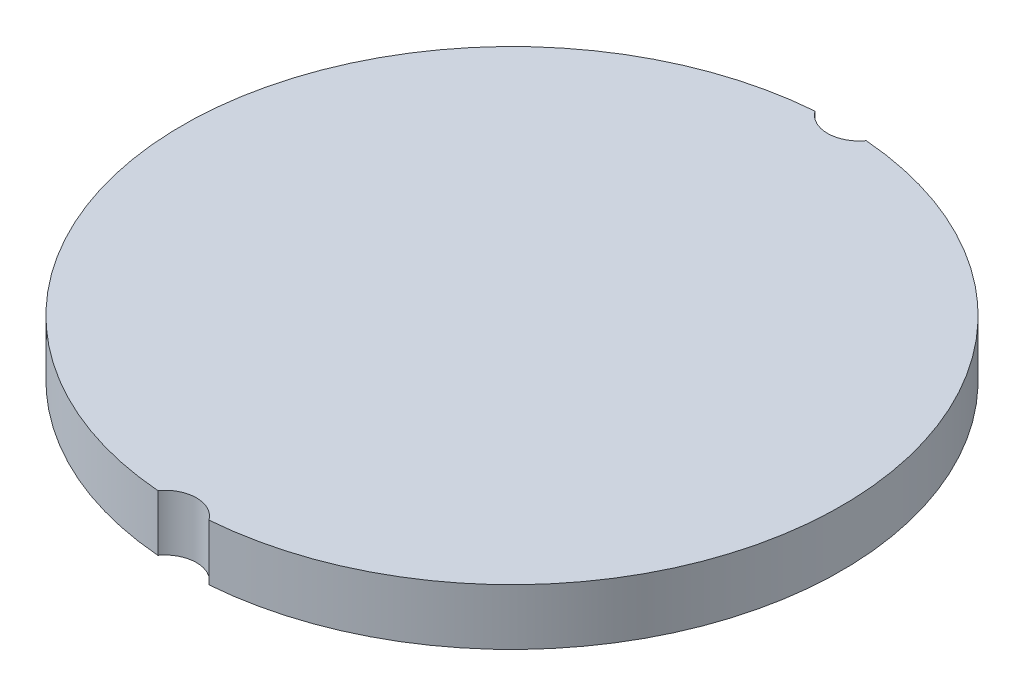
ISO-10303-21;
HEADER;
FILE_DESCRIPTION(('STEP AP214'),'2;1');
FILE_NAME('part.step','',(''),(''),'','','');
FILE_SCHEMA(('AUTOMOTIVE_DESIGN { 1 0 10303 214 1 1 1 1 }'));
ENDSEC;
DATA;
#1=APPLICATION_CONTEXT('core data for automotive mechanical design processes');
#2=APPLICATION_PROTOCOL_DEFINITION('international standard','automotive_design',2000,#1);
#3=PRODUCT_CONTEXT('',#1,'mechanical');
#4=PRODUCT('Part','Part','',(#3));
#5=PRODUCT_RELATED_PRODUCT_CATEGORY('part','',(#4));
#6=PRODUCT_DEFINITION_FORMATION('','',#4);
#7=PRODUCT_DEFINITION_CONTEXT('part definition',#1,'design');
#8=PRODUCT_DEFINITION('design','',#6,#7);
#9=PRODUCT_DEFINITION_SHAPE('','',#8);
#10=(LENGTH_UNIT() NAMED_UNIT(*) SI_UNIT(.MILLI.,.METRE.));
#11=(NAMED_UNIT(*) PLANE_ANGLE_UNIT() SI_UNIT($,.RADIAN.));
#12=(NAMED_UNIT(*) SI_UNIT($,.STERADIAN.) SOLID_ANGLE_UNIT());
#13=UNCERTAINTY_MEASURE_WITH_UNIT(LENGTH_MEASURE(1.E-05),#10,'distance_accuracy_value','');
#14=(GEOMETRIC_REPRESENTATION_CONTEXT(3) GLOBAL_UNCERTAINTY_ASSIGNED_CONTEXT((#13)) GLOBAL_UNIT_ASSIGNED_CONTEXT((#10,
#11,#12)) REPRESENTATION_CONTEXT('',''));
#15=CARTESIAN_POINT('',(0.,0.,0.));
#16=DIRECTION('',(0.,0.,1.));
#17=DIRECTION('',(1.,0.,0.));
#18=AXIS2_PLACEMENT_3D('',#15,#16,#17);
#19=CARTESIAN_POINT('',(7.15000000000003,20.5,20.8783901139862));
#20=DIRECTION('',(0.,-1.,0.));
#21=DIRECTION('',(0.,0.,-1.));
#22=AXIS2_PLACEMENT_3D('',#19,#20,#21);
#23=CYLINDRICAL_SURFACE('',#22,1.12839011398621);
#24=DIRECTION('',(0.,-1.,0.));
#25=VECTOR('',#24,1.);
#26=CARTESIAN_POINT('',(6.23756388030542,20.5,20.2145192102568));
#27=LINE('',#26,#25);
#28=CARTESIAN_POINT('',(6.23756388030542,20.5,20.2145192102568));
#29=VERTEX_POINT('',#28);
#30=CARTESIAN_POINT('',(6.23756388030542,18.5,20.2145192102568));
#31=VERTEX_POINT('',#30);
#32=EDGE_CURVE('E45',#29,#31,#27,.T.);
#33=ORIENTED_EDGE('',*,*,#32,.T.);
#34=CARTESIAN_POINT('',(7.15000000000003,18.5,20.8783901139862));
#35=DIRECTION('',(0.,1.,0.));
#36=DIRECTION('',(0.,0.,1.));
#37=AXIS2_PLACEMENT_3D('',#34,#35,#36);
#38=CIRCLE('',#37,1.12839011398621);
#39=CARTESIAN_POINT('',(8.06243611969464,18.5,20.2145192102568));
#40=VERTEX_POINT('',#39);
#41=EDGE_CURVE('E84',#40,#31,#38,.T.);
#42=ORIENTED_EDGE('',*,*,#41,.F.);
#43=DIRECTION('',(0.,-1.,0.));
#44=VECTOR('',#43,1.);
#45=CARTESIAN_POINT('',(8.06243611969464,20.5,20.2145192102568));
#46=LINE('',#45,#44);
#47=CARTESIAN_POINT('',(8.06243611969464,20.5,20.2145192102568));
#48=VERTEX_POINT('',#47);
#49=EDGE_CURVE('E11',#48,#40,#46,.T.);
#50=ORIENTED_EDGE('',*,*,#49,.F.);
#51=CARTESIAN_POINT('',(7.15000000000003,20.5,20.8783901139862));
#52=DIRECTION('',(0.,1.,0.));
#53=DIRECTION('',(0.,0.,1.));
#54=AXIS2_PLACEMENT_3D('',#51,#52,#53);
#55=CIRCLE('',#54,1.12839011398621);
#56=EDGE_CURVE('E86',#48,#29,#55,.T.);
#57=ORIENTED_EDGE('',*,*,#56,.T.);
#58=EDGE_LOOP('',(#33,#42,#50,#57));
#59=FACE_BOUND('',#58,.T.);
#60=ADVANCED_FACE('F42',(#59),#23,.F.);
#61=CARTESIAN_POINT('',(7.15000000000002,20.5,8.5));
#62=DIRECTION('',(0.,-1.,0.));
#63=DIRECTION('',(0.,0.,-1.));
#64=AXIS2_PLACEMENT_3D('',#61,#62,#63);
#65=CYLINDRICAL_SURFACE('',#64,11.75);
#66=ORIENTED_EDGE('',*,*,#49,.T.);
#67=CARTESIAN_POINT('',(7.15000000000002,18.5,8.5));
#68=DIRECTION('',(0.,1.,0.));
#69=DIRECTION('',(0.,0.,1.));
#70=AXIS2_PLACEMENT_3D('',#67,#68,#69);
#71=CIRCLE('',#70,11.75);
#72=CARTESIAN_POINT('',(8.06243611969464,18.5,-3.21451921025685));
#73=VERTEX_POINT('',#72);
#74=EDGE_CURVE('E98',#40,#73,#71,.T.);
#75=ORIENTED_EDGE('',*,*,#74,.T.);
#76=DIRECTION('',(0.,-1.,0.));
#77=VECTOR('',#76,1.);
#78=CARTESIAN_POINT('',(8.06243611969464,20.5,-3.21451921025685));
#79=LINE('',#78,#77);
#80=CARTESIAN_POINT('',(8.06243611969464,20.5,-3.21451921025685));
#81=VERTEX_POINT('',#80);
#82=EDGE_CURVE('E51',#81,#73,#79,.T.);
#83=ORIENTED_EDGE('',*,*,#82,.F.);
#84=CARTESIAN_POINT('',(7.15000000000002,20.5,8.5));
#85=DIRECTION('',(0.,1.,0.));
#86=DIRECTION('',(0.,0.,1.));
#87=AXIS2_PLACEMENT_3D('',#84,#85,#86);
#88=CIRCLE('',#87,11.75);
#89=EDGE_CURVE('E64',#48,#81,#88,.T.);
#90=ORIENTED_EDGE('',*,*,#89,.F.);
#91=EDGE_LOOP('',(#66,#75,#83,#90));
#92=FACE_BOUND('',#91,.T.);
#93=ADVANCED_FACE('F127',(#92),#65,.T.);
#94=CARTESIAN_POINT('',(7.15000000000003,20.5,-3.87839011398622));
#95=DIRECTION('',(0.,-1.,0.));
#96=DIRECTION('',(0.,0.,-1.));
#97=AXIS2_PLACEMENT_3D('',#94,#95,#96);
#98=CYLINDRICAL_SURFACE('',#97,1.12839011398621);
#99=ORIENTED_EDGE('',*,*,#82,.T.);
#100=CARTESIAN_POINT('',(7.15000000000003,18.5,-3.87839011398622));
#101=DIRECTION('',(0.,1.,0.));
#102=DIRECTION('',(0.,0.,1.));
#103=AXIS2_PLACEMENT_3D('',#100,#101,#102);
#104=CIRCLE('',#103,1.12839011398621);
#105=CARTESIAN_POINT('',(6.23756388030542,18.5,-3.21451921025685));
#106=VERTEX_POINT('',#105);
#107=EDGE_CURVE('E104',#106,#73,#104,.T.);
#108=ORIENTED_EDGE('',*,*,#107,.F.);
#109=DIRECTION('',(0.,-1.,0.));
#110=VECTOR('',#109,1.);
#111=CARTESIAN_POINT('',(6.23756388030542,20.5,-3.21451921025685));
#112=LINE('',#111,#110);
#113=CARTESIAN_POINT('',(6.23756388030542,20.5,-3.21451921025685));
#114=VERTEX_POINT('',#113);
#115=EDGE_CURVE('E91',#114,#106,#112,.T.);
#116=ORIENTED_EDGE('',*,*,#115,.F.);
#117=CARTESIAN_POINT('',(7.15000000000003,20.5,-3.87839011398622));
#118=DIRECTION('',(0.,1.,0.));
#119=DIRECTION('',(0.,0.,1.));
#120=AXIS2_PLACEMENT_3D('',#117,#118,#119);
#121=CIRCLE('',#120,1.12839011398621);
#122=EDGE_CURVE('E116',#114,#81,#121,.T.);
#123=ORIENTED_EDGE('',*,*,#122,.T.);
#124=EDGE_LOOP('',(#99,#108,#116,#123));
#125=FACE_BOUND('',#124,.T.);
#126=ADVANCED_FACE('F125',(#125),#98,.F.);
#127=CARTESIAN_POINT('',(7.15000000000002,20.5,8.5));
#128=DIRECTION('',(0.,-1.,0.));
#129=DIRECTION('',(0.,0.,-1.));
#130=AXIS2_PLACEMENT_3D('',#127,#128,#129);
#131=CYLINDRICAL_SURFACE('',#130,11.75);
#132=ORIENTED_EDGE('',*,*,#115,.T.);
#133=CARTESIAN_POINT('',(7.15000000000002,18.5,8.5));
#134=DIRECTION('',(0.,1.,0.));
#135=DIRECTION('',(0.,0.,1.));
#136=AXIS2_PLACEMENT_3D('',#133,#134,#135);
#137=CIRCLE('',#136,11.75);
#138=EDGE_CURVE('E96',#106,#31,#137,.T.);
#139=ORIENTED_EDGE('',*,*,#138,.T.);
#140=ORIENTED_EDGE('',*,*,#32,.F.);
#141=CARTESIAN_POINT('',(7.15000000000002,20.5,8.5));
#142=DIRECTION('',(0.,1.,0.));
#143=DIRECTION('',(0.,0.,1.));
#144=AXIS2_PLACEMENT_3D('',#141,#142,#143);
#145=CIRCLE('',#144,11.75);
#146=EDGE_CURVE('E113',#114,#29,#145,.T.);
#147=ORIENTED_EDGE('',*,*,#146,.F.);
#148=EDGE_LOOP('',(#132,#139,#140,#147));
#149=FACE_BOUND('',#148,.T.);
#150=ADVANCED_FACE('F101',(#149),#131,.T.);
#151=CARTESIAN_POINT('',(7.15000000000002,20.5,14.6891950569931));
#152=DIRECTION('',(0.,1.,0.));
#153=DIRECTION('',(0.,0.,1.));
#154=AXIS2_PLACEMENT_3D('',#151,#152,#153);
#155=PLANE('',#154);
#156=ORIENTED_EDGE('',*,*,#56,.F.);
#157=ORIENTED_EDGE('',*,*,#89,.T.);
#158=ORIENTED_EDGE('',*,*,#122,.F.);
#159=ORIENTED_EDGE('',*,*,#146,.T.);
#160=EDGE_LOOP('',(#156,#157,#158,#159));
#161=FACE_BOUND('',#160,.T.);
#162=ADVANCED_FACE('F128',(#161),#155,.T.);
#163=CARTESIAN_POINT('',(7.15000000000002,18.5,14.6891950569931));
#164=DIRECTION('',(0.,1.,0.));
#165=DIRECTION('',(0.,0.,1.));
#166=AXIS2_PLACEMENT_3D('',#163,#164,#165);
#167=PLANE('',#166);
#168=ORIENTED_EDGE('',*,*,#41,.T.);
#169=ORIENTED_EDGE('',*,*,#138,.F.);
#170=ORIENTED_EDGE('',*,*,#107,.T.);
#171=ORIENTED_EDGE('',*,*,#74,.F.);
#172=EDGE_LOOP('',(#168,#169,#170,#171));
#173=FACE_BOUND('',#172,.T.);
#174=ADVANCED_FACE('F94',(#173),#167,.F.);
#175=CLOSED_SHELL('',(#60,#93,#126,#150,#162,#174));
#176=MANIFOLD_SOLID_BREP('B2',#175);
#177=ADVANCED_BREP_SHAPE_REPRESENTATION('',(#18,#176),#14);
#178=SHAPE_DEFINITION_REPRESENTATION(#9,#177);
ENDSEC;
END-ISO-10303-21;
